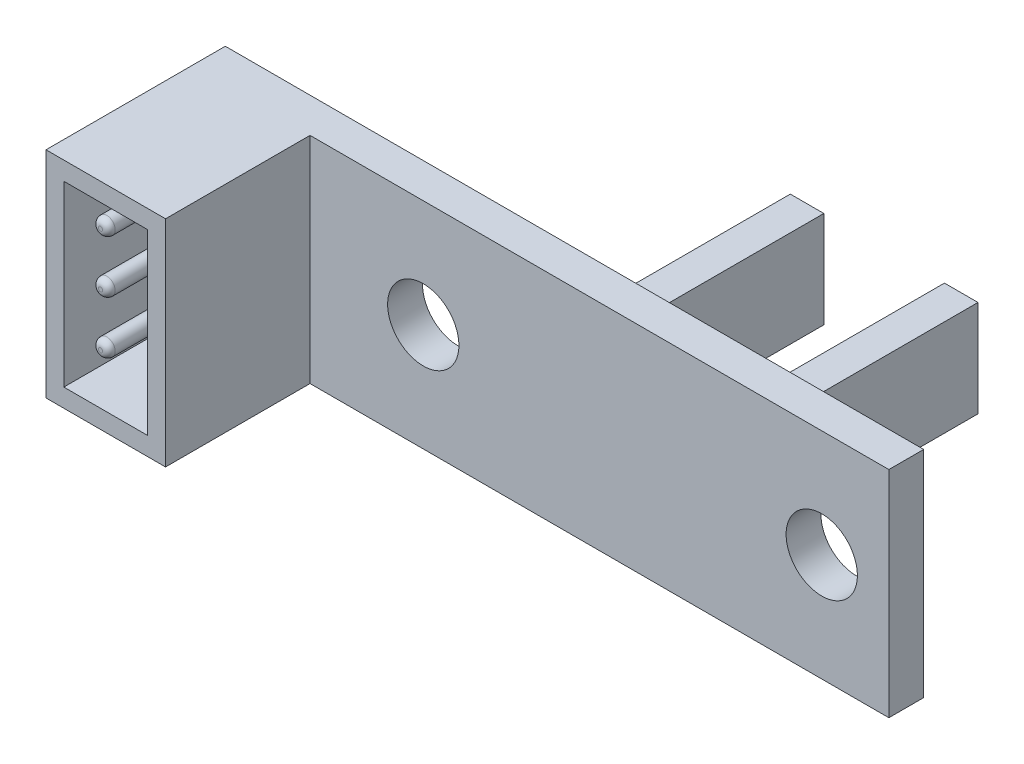
ISO-10303-21;
HEADER;
FILE_DESCRIPTION(('STEP AP214'),'2;1');
FILE_NAME('part.step','',(''),(''),'','','');
FILE_SCHEMA(('AUTOMOTIVE_DESIGN { 1 0 10303 214 1 1 1 1 }'));
ENDSEC;
DATA;
#1=APPLICATION_CONTEXT('core data for automotive mechanical design processes');
#2=APPLICATION_PROTOCOL_DEFINITION('international standard','automotive_design',2000,#1);
#3=PRODUCT_CONTEXT('',#1,'mechanical');
#4=PRODUCT('Part','Part','',(#3));
#5=PRODUCT_RELATED_PRODUCT_CATEGORY('part','',(#4));
#6=PRODUCT_DEFINITION_FORMATION('','',#4);
#7=PRODUCT_DEFINITION_CONTEXT('part definition',#1,'design');
#8=PRODUCT_DEFINITION('design','',#6,#7);
#9=PRODUCT_DEFINITION_SHAPE('','',#8);
#10=(LENGTH_UNIT() NAMED_UNIT(*) SI_UNIT(.MILLI.,.METRE.));
#11=(NAMED_UNIT(*) PLANE_ANGLE_UNIT() SI_UNIT($,.RADIAN.));
#12=(NAMED_UNIT(*) SI_UNIT($,.STERADIAN.) SOLID_ANGLE_UNIT());
#13=UNCERTAINTY_MEASURE_WITH_UNIT(LENGTH_MEASURE(1.E-05),#10,'distance_accuracy_value','');
#14=(GEOMETRIC_REPRESENTATION_CONTEXT(3) GLOBAL_UNCERTAINTY_ASSIGNED_CONTEXT((#13)) GLOBAL_UNIT_ASSIGNED_CONTEXT((#10,
#11,#12)) REPRESENTATION_CONTEXT('',''));
#15=CARTESIAN_POINT('',(0.,0.,0.));
#16=DIRECTION('',(0.,0.,1.));
#17=DIRECTION('',(1.,0.,0.));
#18=AXIS2_PLACEMENT_3D('',#15,#16,#17);
#19=CARTESIAN_POINT('',(0.,0.,0.));
#20=DIRECTION('',(0.,0.,-1.));
#21=DIRECTION('',(-1.,0.,0.));
#22=AXIS2_PLACEMENT_3D('',#19,#20,#21);
#23=PLANE('',#22);
#24=CARTESIAN_POINT('',(11.1,5.125,0.));
#25=DIRECTION('',(0.,0.,1.));
#26=DIRECTION('',(1.,0.,0.));
#27=AXIS2_PLACEMENT_3D('',#24,#25,#26);
#28=CIRCLE('',#27,1.7);
#29=CARTESIAN_POINT('',(12.8,5.125,0.));
#30=VERTEX_POINT('',#29);
#31=EDGE_CURVE('E226',#30,#30,#28,.T.);
#32=ORIENTED_EDGE('',*,*,#31,.T.);
#33=EDGE_LOOP('',(#32));
#34=FACE_BOUND('',#33,.T.);
#35=CARTESIAN_POINT('',(30.1,5.125,0.));
#36=DIRECTION('',(0.,0.,1.));
#37=DIRECTION('',(1.,0.,0.));
#38=AXIS2_PLACEMENT_3D('',#35,#36,#37);
#39=CIRCLE('',#38,1.69999999999999);
#40=CARTESIAN_POINT('',(31.8,5.125,0.));
#41=VERTEX_POINT('',#40);
#42=EDGE_CURVE('E233',#41,#41,#39,.T.);
#43=ORIENTED_EDGE('',*,*,#42,.T.);
#44=EDGE_LOOP('',(#43));
#45=FACE_BOUND('',#44,.T.);
#46=DIRECTION('',(0.,-1.,0.));
#47=VECTOR('',#46,1.);
#48=CARTESIAN_POINT('',(0.,0.,0.));
#49=LINE('',#48,#47);
#50=CARTESIAN_POINT('',(0.,10.25,0.));
#51=VERTEX_POINT('',#50);
#52=CARTESIAN_POINT('',(0.,0.,0.));
#53=VERTEX_POINT('',#52);
#54=EDGE_CURVE('E289',#51,#53,#49,.T.);
#55=ORIENTED_EDGE('',*,*,#54,.F.);
#56=DIRECTION('',(-1.,0.,0.));
#57=VECTOR('',#56,1.);
#58=CARTESIAN_POINT('',(0.,10.25,0.));
#59=LINE('',#58,#57);
#60=CARTESIAN_POINT('',(33.3,10.25,0.));
#61=VERTEX_POINT('',#60);
#62=EDGE_CURVE('E303',#61,#51,#59,.T.);
#63=ORIENTED_EDGE('',*,*,#62,.F.);
#64=DIRECTION('',(0.,1.,0.));
#65=VECTOR('',#64,1.);
#66=CARTESIAN_POINT('',(33.3,0.,0.));
#67=LINE('',#66,#65);
#68=CARTESIAN_POINT('',(33.3,0.,0.));
#69=VERTEX_POINT('',#68);
#70=EDGE_CURVE('E312',#69,#61,#67,.T.);
#71=ORIENTED_EDGE('',*,*,#70,.F.);
#72=DIRECTION('',(1.,0.,0.));
#73=VECTOR('',#72,1.);
#74=CARTESIAN_POINT('',(0.,0.,0.));
#75=LINE('',#74,#73);
#76=EDGE_CURVE('E310',#53,#69,#75,.T.);
#77=ORIENTED_EDGE('',*,*,#76,.F.);
#78=EDGE_LOOP('',(#55,#63,#71,#77));
#79=FACE_BOUND('',#78,.T.);
#80=DIRECTION('',(-1.,0.,0.));
#81=VECTOR('',#80,1.);
#82=CARTESIAN_POINT('',(25.7,2.825,0.));
#83=LINE('',#82,#81);
#84=CARTESIAN_POINT('',(25.7,2.825,0.));
#85=VERTEX_POINT('',#84);
#86=CARTESIAN_POINT('',(24.1,2.825,0.));
#87=VERTEX_POINT('',#86);
#88=EDGE_CURVE('E205',#85,#87,#83,.T.);
#89=ORIENTED_EDGE('',*,*,#88,.F.);
#90=DIRECTION('',(0.,-1.,0.));
#91=VECTOR('',#90,1.);
#92=CARTESIAN_POINT('',(25.7,7.425,0.));
#93=LINE('',#92,#91);
#94=CARTESIAN_POINT('',(25.7,7.425,0.));
#95=VERTEX_POINT('',#94);
#96=EDGE_CURVE('E184',#95,#85,#93,.T.);
#97=ORIENTED_EDGE('',*,*,#96,.F.);
#98=DIRECTION('',(1.,0.,0.));
#99=VECTOR('',#98,1.);
#100=CARTESIAN_POINT('',(25.7,7.425,0.));
#101=LINE('',#100,#99);
#102=CARTESIAN_POINT('',(24.1,7.425,0.));
#103=VERTEX_POINT('',#102);
#104=EDGE_CURVE('E198',#103,#95,#101,.T.);
#105=ORIENTED_EDGE('',*,*,#104,.F.);
#106=DIRECTION('',(0.,1.,0.));
#107=VECTOR('',#106,1.);
#108=CARTESIAN_POINT('',(24.1,7.425,0.));
#109=LINE('',#108,#107);
#110=EDGE_CURVE('E60',#87,#103,#109,.T.);
#111=ORIENTED_EDGE('',*,*,#110,.F.);
#112=EDGE_LOOP('',(#89,#97,#105,#111));
#113=FACE_BOUND('',#112,.T.);
#114=DIRECTION('',(-1.,0.,0.));
#115=VECTOR('',#114,1.);
#116=CARTESIAN_POINT('',(18.35,2.825,0.));
#117=LINE('',#116,#115);
#118=CARTESIAN_POINT('',(18.35,2.825,0.));
#119=VERTEX_POINT('',#118);
#120=CARTESIAN_POINT('',(16.75,2.825,0.));
#121=VERTEX_POINT('',#120);
#122=EDGE_CURVE('E194',#119,#121,#117,.T.);
#123=ORIENTED_EDGE('',*,*,#122,.F.);
#124=DIRECTION('',(0.,-1.,0.));
#125=VECTOR('',#124,1.);
#126=CARTESIAN_POINT('',(18.35,7.425,0.));
#127=LINE('',#126,#125);
#128=CARTESIAN_POINT('',(18.35,7.425,0.));
#129=VERTEX_POINT('',#128);
#130=EDGE_CURVE('E188',#129,#119,#127,.T.);
#131=ORIENTED_EDGE('',*,*,#130,.F.);
#132=DIRECTION('',(1.,0.,0.));
#133=VECTOR('',#132,1.);
#134=CARTESIAN_POINT('',(18.35,7.425,0.));
#135=LINE('',#134,#133);
#136=CARTESIAN_POINT('',(16.75,7.425,0.));
#137=VERTEX_POINT('',#136);
#138=EDGE_CURVE('E168',#137,#129,#135,.T.);
#139=ORIENTED_EDGE('',*,*,#138,.F.);
#140=DIRECTION('',(0.,1.,0.));
#141=VECTOR('',#140,1.);
#142=CARTESIAN_POINT('',(16.75,7.425,0.));
#143=LINE('',#142,#141);
#144=EDGE_CURVE('E52',#121,#137,#143,.T.);
#145=ORIENTED_EDGE('',*,*,#144,.F.);
#146=EDGE_LOOP('',(#123,#131,#139,#145));
#147=FACE_BOUND('',#146,.T.);
#148=ADVANCED_FACE('F37',(#34,#45,#79,#113,#147),#23,.T.);
#149=CARTESIAN_POINT('',(0.,0.,1.66));
#150=DIRECTION('',(0.,0.,-1.));
#151=DIRECTION('',(-1.,0.,0.));
#152=AXIS2_PLACEMENT_3D('',#149,#150,#151);
#153=PLANE('',#152);
#154=CARTESIAN_POINT('',(11.1,5.125,1.66));
#155=DIRECTION('',(0.,0.,1.));
#156=DIRECTION('',(1.,0.,0.));
#157=AXIS2_PLACEMENT_3D('',#154,#155,#156);
#158=CIRCLE('',#157,1.7);
#159=CARTESIAN_POINT('',(12.8,5.125,1.66));
#160=VERTEX_POINT('',#159);
#161=EDGE_CURVE('E230',#160,#160,#158,.T.);
#162=ORIENTED_EDGE('',*,*,#161,.F.);
#163=EDGE_LOOP('',(#162));
#164=FACE_BOUND('',#163,.T.);
#165=CARTESIAN_POINT('',(30.1,5.125,1.66));
#166=DIRECTION('',(0.,0.,1.));
#167=DIRECTION('',(1.,0.,0.));
#168=AXIS2_PLACEMENT_3D('',#165,#166,#167);
#169=CIRCLE('',#168,1.69999999999999);
#170=CARTESIAN_POINT('',(31.8,5.125,1.66));
#171=VERTEX_POINT('',#170);
#172=EDGE_CURVE('E214',#171,#171,#169,.T.);
#173=ORIENTED_EDGE('',*,*,#172,.F.);
#174=EDGE_LOOP('',(#173));
#175=FACE_BOUND('',#174,.T.);
#176=DIRECTION('',(0.,1.,0.));
#177=VECTOR('',#176,1.);
#178=CARTESIAN_POINT('',(5.7,10.25,1.66));
#179=LINE('',#178,#177);
#180=CARTESIAN_POINT('',(5.7,0.,1.66));
#181=VERTEX_POINT('',#180);
#182=CARTESIAN_POINT('',(5.7,10.25,1.66));
#183=VERTEX_POINT('',#182);
#184=EDGE_CURVE('E272',#181,#183,#179,.T.);
#185=ORIENTED_EDGE('',*,*,#184,.F.);
#186=DIRECTION('',(1.,0.,0.));
#187=VECTOR('',#186,1.);
#188=CARTESIAN_POINT('',(0.,0.,1.66));
#189=LINE('',#188,#187);
#190=CARTESIAN_POINT('',(33.3,0.,1.66));
#191=VERTEX_POINT('',#190);
#192=EDGE_CURVE('E300',#181,#191,#189,.T.);
#193=ORIENTED_EDGE('',*,*,#192,.T.);
#194=DIRECTION('',(0.,1.,0.));
#195=VECTOR('',#194,1.);
#196=CARTESIAN_POINT('',(33.3,0.,1.66));
#197=LINE('',#196,#195);
#198=CARTESIAN_POINT('',(33.3,10.25,1.66));
#199=VERTEX_POINT('',#198);
#200=EDGE_CURVE('E302',#191,#199,#197,.T.);
#201=ORIENTED_EDGE('',*,*,#200,.T.);
#202=DIRECTION('',(-1.,0.,0.));
#203=VECTOR('',#202,1.);
#204=CARTESIAN_POINT('',(0.,10.25,1.66));
#205=LINE('',#204,#203);
#206=EDGE_CURVE('E305',#199,#183,#205,.T.);
#207=ORIENTED_EDGE('',*,*,#206,.T.);
#208=EDGE_LOOP('',(#185,#193,#201,#207));
#209=FACE_BOUND('',#208,.T.);
#210=ADVANCED_FACE('F357',(#164,#175,#209),#153,.F.);
#211=CARTESIAN_POINT('',(0.,0.,1.66));
#212=DIRECTION('',(1.,0.,0.));
#213=DIRECTION('',(0.,0.,-1.));
#214=AXIS2_PLACEMENT_3D('',#211,#212,#213);
#215=PLANE('',#214);
#216=ORIENTED_EDGE('',*,*,#54,.T.);
#217=DIRECTION('',(0.,0.,-1.));
#218=VECTOR('',#217,1.);
#219=CARTESIAN_POINT('',(0.,0.,1.66));
#220=LINE('',#219,#218);
#221=CARTESIAN_POINT('',(0.,0.,8.55));
#222=VERTEX_POINT('',#221);
#223=EDGE_CURVE('E323',#222,#53,#220,.T.);
#224=ORIENTED_EDGE('',*,*,#223,.F.);
#225=DIRECTION('',(0.,1.,0.));
#226=VECTOR('',#225,1.);
#227=CARTESIAN_POINT('',(0.,10.25,8.55));
#228=LINE('',#227,#226);
#229=CARTESIAN_POINT('',(0.,10.25,8.55));
#230=VERTEX_POINT('',#229);
#231=EDGE_CURVE('E286',#222,#230,#228,.T.);
#232=ORIENTED_EDGE('',*,*,#231,.T.);
#233=DIRECTION('',(0.,0.,-1.));
#234=VECTOR('',#233,1.);
#235=CARTESIAN_POINT('',(0.,10.25,1.66));
#236=LINE('',#235,#234);
#237=EDGE_CURVE('E307',#230,#51,#236,.T.);
#238=ORIENTED_EDGE('',*,*,#237,.T.);
#239=EDGE_LOOP('',(#216,#224,#232,#238));
#240=FACE_BOUND('',#239,.T.);
#241=ADVANCED_FACE('F365',(#240),#215,.F.);
#242=CARTESIAN_POINT('',(0.,0.,1.66));
#243=DIRECTION('',(0.,1.,0.));
#244=DIRECTION('',(0.,0.,1.));
#245=AXIS2_PLACEMENT_3D('',#242,#243,#244);
#246=PLANE('',#245);
#247=ORIENTED_EDGE('',*,*,#76,.T.);
#248=DIRECTION('',(0.,0.,-1.));
#249=VECTOR('',#248,1.);
#250=CARTESIAN_POINT('',(33.3,0.,1.66));
#251=LINE('',#250,#249);
#252=EDGE_CURVE('E320',#191,#69,#251,.T.);
#253=ORIENTED_EDGE('',*,*,#252,.F.);
#254=ORIENTED_EDGE('',*,*,#192,.F.);
#255=DIRECTION('',(0.,0.,-1.));
#256=VECTOR('',#255,1.);
#257=CARTESIAN_POINT('',(5.7,0.,28.8282777934358));
#258=LINE('',#257,#256);
#259=CARTESIAN_POINT('',(5.7,0.,8.55));
#260=VERTEX_POINT('',#259);
#261=EDGE_CURVE('E295',#260,#181,#258,.T.);
#262=ORIENTED_EDGE('',*,*,#261,.F.);
#263=DIRECTION('',(-1.,0.,0.));
#264=VECTOR('',#263,1.);
#265=CARTESIAN_POINT('',(0.,0.,8.55));
#266=LINE('',#265,#264);
#267=EDGE_CURVE('E282',#260,#222,#266,.T.);
#268=ORIENTED_EDGE('',*,*,#267,.T.);
#269=ORIENTED_EDGE('',*,*,#223,.T.);
#270=EDGE_LOOP('',(#247,#253,#254,#262,#268,#269));
#271=FACE_BOUND('',#270,.T.);
#272=ADVANCED_FACE('F379',(#271),#246,.F.);
#273=CARTESIAN_POINT('',(33.3,0.,1.66));
#274=DIRECTION('',(-1.,0.,0.));
#275=DIRECTION('',(0.,0.,1.));
#276=AXIS2_PLACEMENT_3D('',#273,#274,#275);
#277=PLANE('',#276);
#278=ORIENTED_EDGE('',*,*,#70,.T.);
#279=DIRECTION('',(0.,0.,-1.));
#280=VECTOR('',#279,1.);
#281=CARTESIAN_POINT('',(33.3,10.25,1.66));
#282=LINE('',#281,#280);
#283=EDGE_CURVE('E317',#199,#61,#282,.T.);
#284=ORIENTED_EDGE('',*,*,#283,.F.);
#285=ORIENTED_EDGE('',*,*,#200,.F.);
#286=ORIENTED_EDGE('',*,*,#252,.T.);
#287=EDGE_LOOP('',(#278,#284,#285,#286));
#288=FACE_BOUND('',#287,.T.);
#289=ADVANCED_FACE('F375',(#288),#277,.F.);
#290=CARTESIAN_POINT('',(0.,10.25,1.66));
#291=DIRECTION('',(0.,-1.,0.));
#292=DIRECTION('',(0.,0.,-1.));
#293=AXIS2_PLACEMENT_3D('',#290,#291,#292);
#294=PLANE('',#293);
#295=ORIENTED_EDGE('',*,*,#62,.T.);
#296=ORIENTED_EDGE('',*,*,#237,.F.);
#297=DIRECTION('',(1.,0.,0.));
#298=VECTOR('',#297,1.);
#299=CARTESIAN_POINT('',(0.,10.25,8.55));
#300=LINE('',#299,#298);
#301=CARTESIAN_POINT('',(5.7,10.25,8.55));
#302=VERTEX_POINT('',#301);
#303=EDGE_CURVE('E283',#230,#302,#300,.T.);
#304=ORIENTED_EDGE('',*,*,#303,.T.);
#305=DIRECTION('',(0.,0.,-1.));
#306=VECTOR('',#305,1.);
#307=CARTESIAN_POINT('',(5.7,10.25,28.8282777934358));
#308=LINE('',#307,#306);
#309=EDGE_CURVE('E292',#302,#183,#308,.T.);
#310=ORIENTED_EDGE('',*,*,#309,.T.);
#311=ORIENTED_EDGE('',*,*,#206,.F.);
#312=ORIENTED_EDGE('',*,*,#283,.T.);
#313=EDGE_LOOP('',(#295,#296,#304,#310,#311,#312));
#314=FACE_BOUND('',#313,.T.);
#315=ADVANCED_FACE('F371',(#314),#294,.F.);
#316=CARTESIAN_POINT('',(5.7,10.25,28.8282777934358));
#317=DIRECTION('',(-1.,0.,0.));
#318=DIRECTION('',(0.,-1.,0.));
#319=AXIS2_PLACEMENT_3D('',#316,#317,#318);
#320=PLANE('',#319);
#321=ORIENTED_EDGE('',*,*,#309,.F.);
#322=DIRECTION('',(0.,-1.,0.));
#323=VECTOR('',#322,1.);
#324=CARTESIAN_POINT('',(5.7,10.25,8.55));
#325=LINE('',#324,#323);
#326=EDGE_CURVE('E279',#302,#260,#325,.T.);
#327=ORIENTED_EDGE('',*,*,#326,.T.);
#328=ORIENTED_EDGE('',*,*,#261,.T.);
#329=ORIENTED_EDGE('',*,*,#184,.T.);
#330=EDGE_LOOP('',(#321,#327,#328,#329));
#331=FACE_BOUND('',#330,.T.);
#332=ADVANCED_FACE('F374',(#331),#320,.F.);
#333=CARTESIAN_POINT('',(0.,0.,8.55));
#334=DIRECTION('',(0.,0.,-1.));
#335=DIRECTION('',(-1.,0.,0.));
#336=AXIS2_PLACEMENT_3D('',#333,#334,#335);
#337=PLANE('',#336);
#338=DIRECTION('',(1.,0.,0.));
#339=VECTOR('',#338,1.);
#340=CARTESIAN_POINT('',(0.850000000000001,0.875,8.55));
#341=LINE('',#340,#339);
#342=CARTESIAN_POINT('',(0.850000000000001,0.875,8.55));
#343=VERTEX_POINT('',#342);
#344=CARTESIAN_POINT('',(4.85,0.875,8.55));
#345=VERTEX_POINT('',#344);
#346=EDGE_CURVE('E262',#343,#345,#341,.T.);
#347=ORIENTED_EDGE('',*,*,#346,.F.);
#348=DIRECTION('',(0.,-1.,0.));
#349=VECTOR('',#348,1.);
#350=CARTESIAN_POINT('',(0.850000000000001,9.375,8.55));
#351=LINE('',#350,#349);
#352=CARTESIAN_POINT('',(0.850000000000001,9.375,8.55));
#353=VERTEX_POINT('',#352);
#354=EDGE_CURVE('E246',#353,#343,#351,.T.);
#355=ORIENTED_EDGE('',*,*,#354,.F.);
#356=DIRECTION('',(-1.,0.,0.));
#357=VECTOR('',#356,1.);
#358=CARTESIAN_POINT('',(0.850000000000001,9.375,8.55));
#359=LINE('',#358,#357);
#360=CARTESIAN_POINT('',(4.85,9.375,8.55));
#361=VERTEX_POINT('',#360);
#362=EDGE_CURVE('E251',#361,#353,#359,.T.);
#363=ORIENTED_EDGE('',*,*,#362,.F.);
#364=DIRECTION('',(0.,1.,0.));
#365=VECTOR('',#364,1.);
#366=CARTESIAN_POINT('',(4.85,9.375,8.55));
#367=LINE('',#366,#365);
#368=EDGE_CURVE('E265',#345,#361,#367,.T.);
#369=ORIENTED_EDGE('',*,*,#368,.F.);
#370=EDGE_LOOP('',(#347,#355,#363,#369));
#371=FACE_BOUND('',#370,.T.);
#372=ORIENTED_EDGE('',*,*,#267,.F.);
#373=ORIENTED_EDGE('',*,*,#326,.F.);
#374=ORIENTED_EDGE('',*,*,#303,.F.);
#375=ORIENTED_EDGE('',*,*,#231,.F.);
#376=EDGE_LOOP('',(#372,#373,#374,#375));
#377=FACE_BOUND('',#376,.T.);
#378=ADVANCED_FACE('F431',(#371,#377),#337,.F.);
#379=CARTESIAN_POINT('',(0.850000000000001,9.375,2.5));
#380=DIRECTION('',(-1.,0.,0.));
#381=DIRECTION('',(0.,-1.,0.));
#382=AXIS2_PLACEMENT_3D('',#379,#380,#381);
#383=PLANE('',#382);
#384=ORIENTED_EDGE('',*,*,#354,.T.);
#385=DIRECTION('',(0.,0.,1.));
#386=VECTOR('',#385,1.);
#387=CARTESIAN_POINT('',(0.850000000000001,0.875,2.5));
#388=LINE('',#387,#386);
#389=CARTESIAN_POINT('',(0.850000000000001,0.875,2.5));
#390=VERTEX_POINT('',#389);
#391=EDGE_CURVE('E260',#390,#343,#388,.T.);
#392=ORIENTED_EDGE('',*,*,#391,.F.);
#393=DIRECTION('',(0.,-1.,0.));
#394=VECTOR('',#393,1.);
#395=CARTESIAN_POINT('',(0.850000000000001,9.375,2.5));
#396=LINE('',#395,#394);
#397=CARTESIAN_POINT('',(0.850000000000001,9.375,2.5));
#398=VERTEX_POINT('',#397);
#399=EDGE_CURVE('E247',#398,#390,#396,.T.);
#400=ORIENTED_EDGE('',*,*,#399,.F.);
#401=DIRECTION('',(0.,0.,1.));
#402=VECTOR('',#401,1.);
#403=CARTESIAN_POINT('',(0.850000000000001,9.375,2.5));
#404=LINE('',#403,#402);
#405=EDGE_CURVE('E270',#398,#353,#404,.T.);
#406=ORIENTED_EDGE('',*,*,#405,.T.);
#407=EDGE_LOOP('',(#384,#392,#400,#406));
#408=FACE_BOUND('',#407,.T.);
#409=ADVANCED_FACE('F419',(#408),#383,.F.);
#410=CARTESIAN_POINT('',(0.850000000000001,9.375,2.5));
#411=DIRECTION('',(0.,1.,0.));
#412=DIRECTION('',(0.,0.,1.));
#413=AXIS2_PLACEMENT_3D('',#410,#411,#412);
#414=PLANE('',#413);
#415=ORIENTED_EDGE('',*,*,#362,.T.);
#416=ORIENTED_EDGE('',*,*,#405,.F.);
#417=DIRECTION('',(-1.,0.,0.));
#418=VECTOR('',#417,1.);
#419=CARTESIAN_POINT('',(0.850000000000001,9.375,2.5));
#420=LINE('',#419,#418);
#421=CARTESIAN_POINT('',(4.85,9.375,2.5));
#422=VERTEX_POINT('',#421);
#423=EDGE_CURVE('E257',#422,#398,#420,.T.);
#424=ORIENTED_EDGE('',*,*,#423,.F.);
#425=DIRECTION('',(0.,0.,1.));
#426=VECTOR('',#425,1.);
#427=CARTESIAN_POINT('',(4.85,9.375,2.5));
#428=LINE('',#427,#426);
#429=EDGE_CURVE('E273',#422,#361,#428,.T.);
#430=ORIENTED_EDGE('',*,*,#429,.T.);
#431=EDGE_LOOP('',(#415,#416,#424,#430));
#432=FACE_BOUND('',#431,.T.);
#433=ADVANCED_FACE('F428',(#432),#414,.F.);
#434=CARTESIAN_POINT('',(4.85,9.375,2.5));
#435=DIRECTION('',(1.,0.,0.));
#436=DIRECTION('',(0.,0.,-1.));
#437=AXIS2_PLACEMENT_3D('',#434,#435,#436);
#438=PLANE('',#437);
#439=ORIENTED_EDGE('',*,*,#368,.T.);
#440=ORIENTED_EDGE('',*,*,#429,.F.);
#441=DIRECTION('',(0.,1.,0.));
#442=VECTOR('',#441,1.);
#443=CARTESIAN_POINT('',(4.85,9.375,2.5));
#444=LINE('',#443,#442);
#445=CARTESIAN_POINT('',(4.85,0.875,2.5));
#446=VERTEX_POINT('',#445);
#447=EDGE_CURVE('E254',#446,#422,#444,.T.);
#448=ORIENTED_EDGE('',*,*,#447,.F.);
#449=DIRECTION('',(0.,0.,1.));
#450=VECTOR('',#449,1.);
#451=CARTESIAN_POINT('',(4.85,0.875,2.5));
#452=LINE('',#451,#450);
#453=EDGE_CURVE('E275',#446,#345,#452,.T.);
#454=ORIENTED_EDGE('',*,*,#453,.T.);
#455=EDGE_LOOP('',(#439,#440,#448,#454));
#456=FACE_BOUND('',#455,.T.);
#457=ADVANCED_FACE('F426',(#456),#438,.F.);
#458=CARTESIAN_POINT('',(0.850000000000001,0.875,2.5));
#459=DIRECTION('',(0.,-1.,0.));
#460=DIRECTION('',(0.,0.,-1.));
#461=AXIS2_PLACEMENT_3D('',#458,#459,#460);
#462=PLANE('',#461);
#463=ORIENTED_EDGE('',*,*,#346,.T.);
#464=ORIENTED_EDGE('',*,*,#453,.F.);
#465=DIRECTION('',(1.,0.,0.));
#466=VECTOR('',#465,1.);
#467=CARTESIAN_POINT('',(0.850000000000001,0.875,2.5));
#468=LINE('',#467,#466);
#469=EDGE_CURVE('E250',#390,#446,#468,.T.);
#470=ORIENTED_EDGE('',*,*,#469,.F.);
#471=ORIENTED_EDGE('',*,*,#391,.T.);
#472=EDGE_LOOP('',(#463,#464,#470,#471));
#473=FACE_BOUND('',#472,.T.);
#474=ADVANCED_FACE('F409',(#473),#462,.F.);
#475=CARTESIAN_POINT('',(0.,0.,2.5));
#476=DIRECTION('',(0.,0.,1.));
#477=DIRECTION('',(1.,0.,0.));
#478=AXIS2_PLACEMENT_3D('',#475,#476,#477);
#479=PLANE('',#478);
#480=CARTESIAN_POINT('',(2.0507601910939,2.7210386372354,2.5));
#481=DIRECTION('',(0.,0.,1.));
#482=DIRECTION('',(1.,0.,0.));
#483=AXIS2_PLACEMENT_3D('',#480,#481,#482);
#484=CIRCLE('',#483,0.4);
#485=CARTESIAN_POINT('',(2.4507601910939,2.7210386372354,2.5));
#486=VERTEX_POINT('',#485);
#487=EDGE_CURVE('E229',#486,#486,#484,.T.);
#488=ORIENTED_EDGE('',*,*,#487,.F.);
#489=EDGE_LOOP('',(#488));
#490=FACE_BOUND('',#489,.T.);
#491=CARTESIAN_POINT('',(2.0507601910939,7.7410386372354,2.5));
#492=DIRECTION('',(0.,0.,1.));
#493=DIRECTION('',(1.,0.,0.));
#494=AXIS2_PLACEMENT_3D('',#491,#492,#493);
#495=CIRCLE('',#494,0.4);
#496=CARTESIAN_POINT('',(2.4507601910939,7.7410386372354,2.5));
#497=VERTEX_POINT('',#496);
#498=EDGE_CURVE('E240',#497,#497,#495,.T.);
#499=ORIENTED_EDGE('',*,*,#498,.F.);
#500=EDGE_LOOP('',(#499));
#501=FACE_BOUND('',#500,.T.);
#502=CARTESIAN_POINT('',(2.0507601910939,5.2310386372354,2.5));
#503=DIRECTION('',(0.,0.,1.));
#504=DIRECTION('',(1.,0.,0.));
#505=AXIS2_PLACEMENT_3D('',#502,#503,#504);
#506=CIRCLE('',#505,0.4);
#507=CARTESIAN_POINT('',(2.4507601910939,5.2310386372354,2.5));
#508=VERTEX_POINT('',#507);
#509=EDGE_CURVE('E243',#508,#508,#506,.T.);
#510=ORIENTED_EDGE('',*,*,#509,.F.);
#511=EDGE_LOOP('',(#510));
#512=FACE_BOUND('',#511,.T.);
#513=ORIENTED_EDGE('',*,*,#399,.T.);
#514=ORIENTED_EDGE('',*,*,#469,.T.);
#515=ORIENTED_EDGE('',*,*,#447,.T.);
#516=ORIENTED_EDGE('',*,*,#423,.T.);
#517=EDGE_LOOP('',(#513,#514,#515,#516));
#518=FACE_BOUND('',#517,.T.);
#519=ADVANCED_FACE('F405',(#490,#501,#512,#518),#479,.T.);
#520=CARTESIAN_POINT('',(2.0507601910939,5.2310386372354,8.));
#521=DIRECTION('',(0.,0.,-1.));
#522=DIRECTION('',(-1.,0.,0.));
#523=AXIS2_PLACEMENT_3D('',#520,#521,#522);
#524=CYLINDRICAL_SURFACE('',#523,0.4);
#525=CARTESIAN_POINT('',(2.0507601910939,5.2310386372354,7.7));
#526=DIRECTION('',(0.,0.,1.));
#527=DIRECTION('',(1.,0.,0.));
#528=AXIS2_PLACEMENT_3D('',#525,#526,#527);
#529=CIRCLE('',#528,0.4);
#530=CARTESIAN_POINT('',(2.4507601910939,5.2310386372354,7.7));
#531=VERTEX_POINT('',#530);
#532=EDGE_CURVE('E335',#531,#531,#529,.F.);
#533=ORIENTED_EDGE('',*,*,#532,.T.);
#534=EDGE_LOOP('',(#533));
#535=FACE_BOUND('',#534,.T.);
#536=ORIENTED_EDGE('',*,*,#509,.T.);
#537=EDGE_LOOP('',(#536));
#538=FACE_BOUND('',#537,.T.);
#539=ADVANCED_FACE('F408',(#535,#538),#524,.T.);
#540=CARTESIAN_POINT('',(2.0507601910939,5.2310386372354,8.));
#541=DIRECTION('',(0.,0.,1.));
#542=DIRECTION('',(1.,0.,0.));
#543=AXIS2_PLACEMENT_3D('',#540,#541,#542);
#544=PLANE('',#543);
#545=CARTESIAN_POINT('',(2.0507601910939,5.2310386372354,8.));
#546=DIRECTION('',(0.,0.,1.));
#547=DIRECTION('',(1.,0.,0.));
#548=AXIS2_PLACEMENT_3D('',#545,#546,#547);
#549=CIRCLE('',#548,0.1);
#550=CARTESIAN_POINT('',(2.1507601910939,5.2310386372354,8.));
#551=VERTEX_POINT('',#550);
#552=EDGE_CURVE('E332',#551,#551,#549,.T.);
#553=ORIENTED_EDGE('',*,*,#552,.T.);
#554=EDGE_LOOP('',(#553));
#555=FACE_BOUND('',#554,.T.);
#556=ADVANCED_FACE('F502',(#555),#544,.T.);
#557=CARTESIAN_POINT('',(2.0507601910939,7.7410386372354,8.));
#558=DIRECTION('',(0.,0.,-1.));
#559=DIRECTION('',(-1.,0.,0.));
#560=AXIS2_PLACEMENT_3D('',#557,#558,#559);
#561=CYLINDRICAL_SURFACE('',#560,0.4);
#562=CARTESIAN_POINT('',(2.0507601910939,7.7410386372354,7.7));
#563=DIRECTION('',(0.,0.,1.));
#564=DIRECTION('',(1.,0.,0.));
#565=AXIS2_PLACEMENT_3D('',#562,#563,#564);
#566=CIRCLE('',#565,0.4);
#567=CARTESIAN_POINT('',(2.4507601910939,7.7410386372354,7.7));
#568=VERTEX_POINT('',#567);
#569=EDGE_CURVE('E12',#568,#568,#566,.F.);
#570=ORIENTED_EDGE('',*,*,#569,.T.);
#571=EDGE_LOOP('',(#570));
#572=FACE_BOUND('',#571,.T.);
#573=ORIENTED_EDGE('',*,*,#498,.T.);
#574=EDGE_LOOP('',(#573));
#575=FACE_BOUND('',#574,.T.);
#576=ADVANCED_FACE('F499',(#572,#575),#561,.T.);
#577=CARTESIAN_POINT('',(2.0507601910939,7.7410386372354,8.));
#578=DIRECTION('',(0.,0.,1.));
#579=DIRECTION('',(1.,0.,0.));
#580=AXIS2_PLACEMENT_3D('',#577,#578,#579);
#581=PLANE('',#580);
#582=CARTESIAN_POINT('',(2.0507601910939,7.7410386372354,8.));
#583=DIRECTION('',(0.,0.,1.));
#584=DIRECTION('',(1.,0.,0.));
#585=AXIS2_PLACEMENT_3D('',#582,#583,#584);
#586=CIRCLE('',#585,0.1);
#587=CARTESIAN_POINT('',(2.1507601910939,7.7410386372354,8.));
#588=VERTEX_POINT('',#587);
#589=EDGE_CURVE('E45',#588,#588,#586,.T.);
#590=ORIENTED_EDGE('',*,*,#589,.T.);
#591=EDGE_LOOP('',(#590));
#592=FACE_BOUND('',#591,.T.);
#593=ADVANCED_FACE('F340',(#592),#581,.T.);
#594=CARTESIAN_POINT('',(2.0507601910939,2.7210386372354,8.));
#595=DIRECTION('',(0.,0.,-1.));
#596=DIRECTION('',(-1.,0.,0.));
#597=AXIS2_PLACEMENT_3D('',#594,#595,#596);
#598=CYLINDRICAL_SURFACE('',#597,0.4);
#599=CARTESIAN_POINT('',(2.0507601910939,2.7210386372354,7.7));
#600=DIRECTION('',(0.,0.,1.));
#601=DIRECTION('',(1.,0.,0.));
#602=AXIS2_PLACEMENT_3D('',#599,#600,#601);
#603=CIRCLE('',#602,0.4);
#604=CARTESIAN_POINT('',(2.4507601910939,2.7210386372354,7.7));
#605=VERTEX_POINT('',#604);
#606=EDGE_CURVE('E329',#605,#605,#603,.F.);
#607=ORIENTED_EDGE('',*,*,#606,.T.);
#608=EDGE_LOOP('',(#607));
#609=FACE_BOUND('',#608,.T.);
#610=ORIENTED_EDGE('',*,*,#487,.T.);
#611=EDGE_LOOP('',(#610));
#612=FACE_BOUND('',#611,.T.);
#613=ADVANCED_FACE('F393',(#609,#612),#598,.T.);
#614=CARTESIAN_POINT('',(2.0507601910939,2.7210386372354,8.));
#615=DIRECTION('',(0.,0.,1.));
#616=DIRECTION('',(1.,0.,0.));
#617=AXIS2_PLACEMENT_3D('',#614,#615,#616);
#618=PLANE('',#617);
#619=CARTESIAN_POINT('',(2.0507601910939,2.7210386372354,8.));
#620=DIRECTION('',(0.,0.,1.));
#621=DIRECTION('',(1.,0.,0.));
#622=AXIS2_PLACEMENT_3D('',#619,#620,#621);
#623=CIRCLE('',#622,0.1);
#624=CARTESIAN_POINT('',(2.1507601910939,2.7210386372354,8.));
#625=VERTEX_POINT('',#624);
#626=EDGE_CURVE('E326',#625,#625,#623,.T.);
#627=ORIENTED_EDGE('',*,*,#626,.T.);
#628=EDGE_LOOP('',(#627));
#629=FACE_BOUND('',#628,.T.);
#630=ADVANCED_FACE('F388',(#629),#618,.T.);
#631=CARTESIAN_POINT('',(2.0507601910939,2.7210386372354,7.7));
#632=DIRECTION('',(0.,0.,1.));
#633=DIRECTION('',(1.,0.,0.));
#634=AXIS2_PLACEMENT_3D('',#631,#632,#633);
#635=DEGENERATE_TOROIDAL_SURFACE('',#634,0.1,0.3,.T.);
#636=ORIENTED_EDGE('',*,*,#606,.F.);
#637=EDGE_LOOP('',(#636));
#638=FACE_BOUND('',#637,.T.);
#639=ORIENTED_EDGE('',*,*,#626,.F.);
#640=EDGE_LOOP('',(#639));
#641=FACE_BOUND('',#640,.T.);
#642=ADVANCED_FACE('F353',(#638,#641),#635,.T.);
#643=CARTESIAN_POINT('',(2.0507601910939,5.2310386372354,7.7));
#644=DIRECTION('',(0.,0.,1.));
#645=DIRECTION('',(1.,0.,0.));
#646=AXIS2_PLACEMENT_3D('',#643,#644,#645);
#647=DEGENERATE_TOROIDAL_SURFACE('',#646,0.1,0.3,.T.);
#648=ORIENTED_EDGE('',*,*,#532,.F.);
#649=EDGE_LOOP('',(#648));
#650=FACE_BOUND('',#649,.T.);
#651=ORIENTED_EDGE('',*,*,#552,.F.);
#652=EDGE_LOOP('',(#651));
#653=FACE_BOUND('',#652,.T.);
#654=ADVANCED_FACE('F344',(#650,#653),#647,.T.);
#655=CARTESIAN_POINT('',(2.0507601910939,7.7410386372354,7.7));
#656=DIRECTION('',(0.,0.,1.));
#657=DIRECTION('',(1.,0.,0.));
#658=AXIS2_PLACEMENT_3D('',#655,#656,#657);
#659=DEGENERATE_TOROIDAL_SURFACE('',#658,0.1,0.3,.T.);
#660=ORIENTED_EDGE('',*,*,#569,.F.);
#661=EDGE_LOOP('',(#660));
#662=FACE_BOUND('',#661,.T.);
#663=ORIENTED_EDGE('',*,*,#589,.F.);
#664=EDGE_LOOP('',(#663));
#665=FACE_BOUND('',#664,.T.);
#666=ADVANCED_FACE('F39',(#662,#665),#659,.T.);
#667=CARTESIAN_POINT('',(30.1,5.125,0.));
#668=DIRECTION('',(0.,0.,1.));
#669=DIRECTION('',(1.,0.,0.));
#670=AXIS2_PLACEMENT_3D('',#667,#668,#669);
#671=CYLINDRICAL_SURFACE('',#670,1.69999999999999);
#672=CARTESIAN_POINT('',(31.8,5.125,0.));
#673=CARTESIAN_POINT('',(31.8,5.125,0.0172916666666666));
#674=CARTESIAN_POINT('',(31.8,5.125,0.0345833333333333));
#675=CARTESIAN_POINT('',(31.8,5.125,0.0691666666666667));
#676=CARTESIAN_POINT('',(31.8,5.125,0.0864583333333333));
#677=CARTESIAN_POINT('',(31.8,5.125,0.121041666666667));
#678=CARTESIAN_POINT('',(31.8,5.125,0.138333333333333));
#679=CARTESIAN_POINT('',(31.8,5.125,0.172916666666667));
#680=CARTESIAN_POINT('',(31.8,5.125,0.190208333333333));
#681=CARTESIAN_POINT('',(31.8,5.125,0.224791666666667));
#682=CARTESIAN_POINT('',(31.8,5.125,0.242083333333333));
#683=CARTESIAN_POINT('',(31.8,5.125,0.276666666666667));
#684=CARTESIAN_POINT('',(31.8,5.125,0.293958333333333));
#685=CARTESIAN_POINT('',(31.8,5.125,0.328541666666667));
#686=CARTESIAN_POINT('',(31.8,5.125,0.345833333333333));
#687=CARTESIAN_POINT('',(31.8,5.125,0.380416666666667));
#688=CARTESIAN_POINT('',(31.8,5.125,0.397708333333333));
#689=CARTESIAN_POINT('',(31.8,5.125,0.432291666666667));
#690=CARTESIAN_POINT('',(31.8,5.125,0.449583333333333));
#691=CARTESIAN_POINT('',(31.8,5.125,0.484166666666667));
#692=CARTESIAN_POINT('',(31.8,5.125,0.501458333333333));
#693=CARTESIAN_POINT('',(31.8,5.125,0.536041666666667));
#694=CARTESIAN_POINT('',(31.8,5.125,0.553333333333333));
#695=CARTESIAN_POINT('',(31.8,5.125,0.587916666666667));
#696=CARTESIAN_POINT('',(31.8,5.125,0.605208333333333));
#697=CARTESIAN_POINT('',(31.8,5.125,0.639791666666667));
#698=CARTESIAN_POINT('',(31.8,5.125,0.657083333333333));
#699=CARTESIAN_POINT('',(31.8,5.125,0.691666666666667));
#700=CARTESIAN_POINT('',(31.8,5.125,0.708958333333333));
#701=CARTESIAN_POINT('',(31.8,5.125,0.743541666666667));
#702=CARTESIAN_POINT('',(31.8,5.125,0.760833333333333));
#703=CARTESIAN_POINT('',(31.8,5.125,0.795416666666666));
#704=CARTESIAN_POINT('',(31.8,5.125,0.812708333333333));
#705=CARTESIAN_POINT('',(31.8,5.125,0.847291666666667));
#706=CARTESIAN_POINT('',(31.8,5.125,0.864583333333333));
#707=CARTESIAN_POINT('',(31.8,5.125,0.899166666666667));
#708=CARTESIAN_POINT('',(31.8,5.125,0.916458333333333));
#709=CARTESIAN_POINT('',(31.8,5.125,0.951041666666667));
#710=CARTESIAN_POINT('',(31.8,5.125,0.968333333333333));
#711=CARTESIAN_POINT('',(31.8,5.125,1.00291666666667));
#712=CARTESIAN_POINT('',(31.8,5.125,1.02020833333333));
#713=CARTESIAN_POINT('',(31.8,5.125,1.05479166666667));
#714=CARTESIAN_POINT('',(31.8,5.125,1.07208333333333));
#715=CARTESIAN_POINT('',(31.8,5.125,1.10666666666667));
#716=CARTESIAN_POINT('',(31.8,5.125,1.12395833333333));
#717=CARTESIAN_POINT('',(31.8,5.125,1.15854166666667));
#718=CARTESIAN_POINT('',(31.8,5.125,1.17583333333333));
#719=CARTESIAN_POINT('',(31.8,5.125,1.21041666666667));
#720=CARTESIAN_POINT('',(31.8,5.125,1.22770833333333));
#721=CARTESIAN_POINT('',(31.8,5.125,1.26229166666667));
#722=CARTESIAN_POINT('',(31.8,5.125,1.27958333333333));
#723=CARTESIAN_POINT('',(31.8,5.125,1.31416666666667));
#724=CARTESIAN_POINT('',(31.8,5.125,1.33145833333333));
#725=CARTESIAN_POINT('',(31.8,5.125,1.36604166666667));
#726=CARTESIAN_POINT('',(31.8,5.125,1.38333333333333));
#727=CARTESIAN_POINT('',(31.8,5.125,1.41791666666667));
#728=CARTESIAN_POINT('',(31.8,5.125,1.43520833333333));
#729=CARTESIAN_POINT('',(31.8,5.125,1.46979166666667));
#730=CARTESIAN_POINT('',(31.8,5.125,1.48708333333333));
#731=CARTESIAN_POINT('',(31.8,5.125,1.52166666666667));
#732=CARTESIAN_POINT('',(31.8,5.125,1.53895833333333));
#733=CARTESIAN_POINT('',(31.8,5.125,1.57354166666667));
#734=CARTESIAN_POINT('',(31.8,5.125,1.59083333333333));
#735=CARTESIAN_POINT('',(31.8,5.125,1.62541666666667));
#736=CARTESIAN_POINT('',(31.8,5.125,1.64270833333333));
#737=CARTESIAN_POINT('',(31.8,5.125,1.66));
#738=B_SPLINE_CURVE_WITH_KNOTS('',3,(#672,#673,#674,#675,#676,#677,#678,#679,#680,#681,#682,
#683,#684,#685,#686,#687,#688,#689,#690,#691,#692,#693,#694,#695,#696,#697,#698,#699,#700,#701,
#702,#703,#704,#705,#706,#707,#708,#709,#710,#711,#712,#713,#714,#715,#716,#717,#718,#719,#720,
#721,#722,#723,#724,#725,#726,#727,#728,#729,#730,#731,#732,#733,#734,#735,#736,#737),
.UNSPECIFIED.,.F.,.F.,(4,2,2,2,2,2,2,2,2,2,2,2,2,2,2,2,2,2,2,2,2,2,2,2,2,2,2,2,2,2,2,2,4),(0.,
0.051875,0.10375,0.155625,0.2075,0.259375,0.31125,0.363125,0.415,0.466875,0.51875,0.570625,
0.6225,0.674375,0.72625,0.778125,0.83,0.881875,0.93375,0.985625,1.0375,1.089375,1.14125,
1.193125,1.245,1.296875,1.34875,1.400625,1.4525,1.504375,1.55625,1.608125,1.66),.UNSPECIFIED.);
#739=EDGE_CURVE('BSEAM343',#41,#171,#738,.T.);
#740=ORIENTED_EDGE('',*,*,#42,.F.);
#741=ORIENTED_EDGE('',*,*,#172,.T.);
#742=ORIENTED_EDGE('',*,*,#739,.T.);
#743=ORIENTED_EDGE('',*,*,#739,.F.);
#744=EDGE_LOOP('',(#740,#742,#741,#743));
#745=FACE_BOUND('',#744,.T.);
#746=ADVANCED_FACE('F343',(#745),#671,.F.);
#747=CARTESIAN_POINT('',(11.1,5.125,0.));
#748=DIRECTION('',(0.,0.,1.));
#749=DIRECTION('',(1.,0.,0.));
#750=AXIS2_PLACEMENT_3D('',#747,#748,#749);
#751=CYLINDRICAL_SURFACE('',#750,1.7);
#752=CARTESIAN_POINT('',(12.8,5.125,0.));
#753=CARTESIAN_POINT('',(12.8,5.125,0.0172916666666666));
#754=CARTESIAN_POINT('',(12.8,5.125,0.0345833333333333));
#755=CARTESIAN_POINT('',(12.8,5.125,0.0691666666666667));
#756=CARTESIAN_POINT('',(12.8,5.125,0.0864583333333333));
#757=CARTESIAN_POINT('',(12.8,5.125,0.121041666666667));
#758=CARTESIAN_POINT('',(12.8,5.125,0.138333333333333));
#759=CARTESIAN_POINT('',(12.8,5.125,0.172916666666667));
#760=CARTESIAN_POINT('',(12.8,5.125,0.190208333333333));
#761=CARTESIAN_POINT('',(12.8,5.125,0.224791666666667));
#762=CARTESIAN_POINT('',(12.8,5.125,0.242083333333333));
#763=CARTESIAN_POINT('',(12.8,5.125,0.276666666666667));
#764=CARTESIAN_POINT('',(12.8,5.125,0.293958333333333));
#765=CARTESIAN_POINT('',(12.8,5.125,0.328541666666667));
#766=CARTESIAN_POINT('',(12.8,5.125,0.345833333333333));
#767=CARTESIAN_POINT('',(12.8,5.125,0.380416666666667));
#768=CARTESIAN_POINT('',(12.8,5.125,0.397708333333333));
#769=CARTESIAN_POINT('',(12.8,5.125,0.432291666666667));
#770=CARTESIAN_POINT('',(12.8,5.125,0.449583333333333));
#771=CARTESIAN_POINT('',(12.8,5.125,0.484166666666667));
#772=CARTESIAN_POINT('',(12.8,5.125,0.501458333333333));
#773=CARTESIAN_POINT('',(12.8,5.125,0.536041666666667));
#774=CARTESIAN_POINT('',(12.8,5.125,0.553333333333333));
#775=CARTESIAN_POINT('',(12.8,5.125,0.587916666666667));
#776=CARTESIAN_POINT('',(12.8,5.125,0.605208333333333));
#777=CARTESIAN_POINT('',(12.8,5.125,0.639791666666667));
#778=CARTESIAN_POINT('',(12.8,5.125,0.657083333333333));
#779=CARTESIAN_POINT('',(12.8,5.125,0.691666666666667));
#780=CARTESIAN_POINT('',(12.8,5.125,0.708958333333333));
#781=CARTESIAN_POINT('',(12.8,5.125,0.743541666666667));
#782=CARTESIAN_POINT('',(12.8,5.125,0.760833333333333));
#783=CARTESIAN_POINT('',(12.8,5.125,0.795416666666666));
#784=CARTESIAN_POINT('',(12.8,5.125,0.812708333333333));
#785=CARTESIAN_POINT('',(12.8,5.125,0.847291666666667));
#786=CARTESIAN_POINT('',(12.8,5.125,0.864583333333333));
#787=CARTESIAN_POINT('',(12.8,5.125,0.899166666666667));
#788=CARTESIAN_POINT('',(12.8,5.125,0.916458333333333));
#789=CARTESIAN_POINT('',(12.8,5.125,0.951041666666667));
#790=CARTESIAN_POINT('',(12.8,5.125,0.968333333333333));
#791=CARTESIAN_POINT('',(12.8,5.125,1.00291666666667));
#792=CARTESIAN_POINT('',(12.8,5.125,1.02020833333333));
#793=CARTESIAN_POINT('',(12.8,5.125,1.05479166666667));
#794=CARTESIAN_POINT('',(12.8,5.125,1.07208333333333));
#795=CARTESIAN_POINT('',(12.8,5.125,1.10666666666667));
#796=CARTESIAN_POINT('',(12.8,5.125,1.12395833333333));
#797=CARTESIAN_POINT('',(12.8,5.125,1.15854166666667));
#798=CARTESIAN_POINT('',(12.8,5.125,1.17583333333333));
#799=CARTESIAN_POINT('',(12.8,5.125,1.21041666666667));
#800=CARTESIAN_POINT('',(12.8,5.125,1.22770833333333));
#801=CARTESIAN_POINT('',(12.8,5.125,1.26229166666667));
#802=CARTESIAN_POINT('',(12.8,5.125,1.27958333333333));
#803=CARTESIAN_POINT('',(12.8,5.125,1.31416666666667));
#804=CARTESIAN_POINT('',(12.8,5.125,1.33145833333333));
#805=CARTESIAN_POINT('',(12.8,5.125,1.36604166666667));
#806=CARTESIAN_POINT('',(12.8,5.125,1.38333333333333));
#807=CARTESIAN_POINT('',(12.8,5.125,1.41791666666667));
#808=CARTESIAN_POINT('',(12.8,5.125,1.43520833333333));
#809=CARTESIAN_POINT('',(12.8,5.125,1.46979166666667));
#810=CARTESIAN_POINT('',(12.8,5.125,1.48708333333333));
#811=CARTESIAN_POINT('',(12.8,5.125,1.52166666666667));
#812=CARTESIAN_POINT('',(12.8,5.125,1.53895833333333));
#813=CARTESIAN_POINT('',(12.8,5.125,1.57354166666667));
#814=CARTESIAN_POINT('',(12.8,5.125,1.59083333333333));
#815=CARTESIAN_POINT('',(12.8,5.125,1.62541666666667));
#816=CARTESIAN_POINT('',(12.8,5.125,1.64270833333333));
#817=CARTESIAN_POINT('',(12.8,5.125,1.66));
#818=B_SPLINE_CURVE_WITH_KNOTS('',3,(#752,#753,#754,#755,#756,#757,#758,#759,#760,#761,#762,
#763,#764,#765,#766,#767,#768,#769,#770,#771,#772,#773,#774,#775,#776,#777,#778,#779,#780,#781,
#782,#783,#784,#785,#786,#787,#788,#789,#790,#791,#792,#793,#794,#795,#796,#797,#798,#799,#800,
#801,#802,#803,#804,#805,#806,#807,#808,#809,#810,#811,#812,#813,#814,#815,#816,#817),
.UNSPECIFIED.,.F.,.F.,(4,2,2,2,2,2,2,2,2,2,2,2,2,2,2,2,2,2,2,2,2,2,2,2,2,2,2,2,2,2,2,2,4),(0.,
0.051875,0.10375,0.155625,0.2075,0.259375,0.31125,0.363125,0.415,0.466875,0.51875,0.570625,
0.6225,0.674375,0.72625,0.778125,0.83,0.881875,0.93375,0.985625,1.0375,1.089375,1.14125,
1.193125,1.245,1.296875,1.34875,1.400625,1.4525,1.504375,1.55625,1.608125,1.66),.UNSPECIFIED.);
#819=EDGE_CURVE('BSEAM350',#30,#160,#818,.T.);
#820=ORIENTED_EDGE('',*,*,#31,.F.);
#821=ORIENTED_EDGE('',*,*,#161,.T.);
#822=ORIENTED_EDGE('',*,*,#819,.T.);
#823=ORIENTED_EDGE('',*,*,#819,.F.);
#824=EDGE_LOOP('',(#820,#822,#821,#823));
#825=FACE_BOUND('',#824,.T.);
#826=ADVANCED_FACE('F350',(#825),#751,.F.);
#827=CARTESIAN_POINT('',(25.7,7.425,-26.9103182647544));
#828=DIRECTION('',(-1.,0.,0.));
#829=DIRECTION('',(0.,0.,1.));
#830=AXIS2_PLACEMENT_3D('',#827,#828,#829);
#831=PLANE('',#830);
#832=DIRECTION('',(0.,-1.,0.));
#833=VECTOR('',#832,1.);
#834=CARTESIAN_POINT('',(25.7,7.425,-10.19));
#835=LINE('',#834,#833);
#836=CARTESIAN_POINT('',(25.7,7.425,-10.19));
#837=VERTEX_POINT('',#836);
#838=CARTESIAN_POINT('',(25.7,2.825,-10.19));
#839=VERTEX_POINT('',#838);
#840=EDGE_CURVE('E218',#837,#839,#835,.T.);
#841=ORIENTED_EDGE('',*,*,#840,.F.);
#842=DIRECTION('',(0.,0.,1.));
#843=VECTOR('',#842,1.);
#844=CARTESIAN_POINT('',(25.7,7.425,-26.9103182647544));
#845=LINE('',#844,#843);
#846=EDGE_CURVE('E182',#837,#95,#845,.T.);
#847=ORIENTED_EDGE('',*,*,#846,.T.);
#848=ORIENTED_EDGE('',*,*,#96,.T.);
#849=DIRECTION('',(0.,0.,1.));
#850=VECTOR('',#849,1.);
#851=CARTESIAN_POINT('',(25.7,2.825,-26.9103182647544));
#852=LINE('',#851,#850);
#853=EDGE_CURVE('E208',#839,#85,#852,.T.);
#854=ORIENTED_EDGE('',*,*,#853,.F.);
#855=EDGE_LOOP('',(#841,#847,#848,#854));
#856=FACE_BOUND('',#855,.T.);
#857=ADVANCED_FACE('F489',(#856),#831,.F.);
#858=CARTESIAN_POINT('',(25.7,2.825,-26.9103182647544));
#859=DIRECTION('',(0.,1.,0.));
#860=DIRECTION('',(0.,0.,1.));
#861=AXIS2_PLACEMENT_3D('',#858,#859,#860);
#862=PLANE('',#861);
#863=DIRECTION('',(-1.,0.,0.));
#864=VECTOR('',#863,1.);
#865=CARTESIAN_POINT('',(25.7,2.825,-10.19));
#866=LINE('',#865,#864);
#867=CARTESIAN_POINT('',(24.1,2.825,-10.19));
#868=VERTEX_POINT('',#867);
#869=EDGE_CURVE('E215',#839,#868,#866,.T.);
#870=ORIENTED_EDGE('',*,*,#869,.F.);
#871=ORIENTED_EDGE('',*,*,#853,.T.);
#872=ORIENTED_EDGE('',*,*,#88,.T.);
#873=DIRECTION('',(0.,0.,1.));
#874=VECTOR('',#873,1.);
#875=CARTESIAN_POINT('',(24.1,2.825,-26.9103182647544));
#876=LINE('',#875,#874);
#877=EDGE_CURVE('E204',#868,#87,#876,.T.);
#878=ORIENTED_EDGE('',*,*,#877,.F.);
#879=EDGE_LOOP('',(#870,#871,#872,#878));
#880=FACE_BOUND('',#879,.T.);
#881=ADVANCED_FACE('F486',(#880),#862,.F.);
#882=CARTESIAN_POINT('',(24.1,7.425,-26.9103182647544));
#883=DIRECTION('',(1.,0.,0.));
#884=DIRECTION('',(0.,0.,-1.));
#885=AXIS2_PLACEMENT_3D('',#882,#883,#884);
#886=PLANE('',#885);
#887=DIRECTION('',(0.,1.,0.));
#888=VECTOR('',#887,1.);
#889=CARTESIAN_POINT('',(24.1,7.425,-10.19));
#890=LINE('',#889,#888);
#891=CARTESIAN_POINT('',(24.1,7.425,-10.19));
#892=VERTEX_POINT('',#891);
#893=EDGE_CURVE('E211',#868,#892,#890,.T.);
#894=ORIENTED_EDGE('',*,*,#893,.F.);
#895=ORIENTED_EDGE('',*,*,#877,.T.);
#896=ORIENTED_EDGE('',*,*,#110,.T.);
#897=DIRECTION('',(0.,0.,1.));
#898=VECTOR('',#897,1.);
#899=CARTESIAN_POINT('',(24.1,7.425,-26.9103182647544));
#900=LINE('',#899,#898);
#901=EDGE_CURVE('E202',#892,#103,#900,.T.);
#902=ORIENTED_EDGE('',*,*,#901,.F.);
#903=EDGE_LOOP('',(#894,#895,#896,#902));
#904=FACE_BOUND('',#903,.T.);
#905=ADVANCED_FACE('F482',(#904),#886,.F.);
#906=CARTESIAN_POINT('',(25.7,7.425,-26.9103182647544));
#907=DIRECTION('',(0.,-1.,0.));
#908=DIRECTION('',(0.,0.,-1.));
#909=AXIS2_PLACEMENT_3D('',#906,#907,#908);
#910=PLANE('',#909);
#911=DIRECTION('',(1.,0.,0.));
#912=VECTOR('',#911,1.);
#913=CARTESIAN_POINT('',(25.7,7.425,-10.19));
#914=LINE('',#913,#912);
#915=EDGE_CURVE('E201',#892,#837,#914,.T.);
#916=ORIENTED_EDGE('',*,*,#915,.F.);
#917=ORIENTED_EDGE('',*,*,#901,.T.);
#918=ORIENTED_EDGE('',*,*,#104,.T.);
#919=ORIENTED_EDGE('',*,*,#846,.F.);
#920=EDGE_LOOP('',(#916,#917,#918,#919));
#921=FACE_BOUND('',#920,.T.);
#922=ADVANCED_FACE('F473',(#921),#910,.F.);
#923=CARTESIAN_POINT('',(0.,0.,-10.19));
#924=DIRECTION('',(0.,0.,-1.));
#925=DIRECTION('',(-1.,0.,0.));
#926=AXIS2_PLACEMENT_3D('',#923,#924,#925);
#927=PLANE('',#926);
#928=ORIENTED_EDGE('',*,*,#915,.T.);
#929=ORIENTED_EDGE('',*,*,#840,.T.);
#930=ORIENTED_EDGE('',*,*,#869,.T.);
#931=ORIENTED_EDGE('',*,*,#893,.T.);
#932=EDGE_LOOP('',(#928,#929,#930,#931));
#933=FACE_BOUND('',#932,.T.);
#934=ADVANCED_FACE('F466',(#933),#927,.T.);
#935=CARTESIAN_POINT('',(18.35,7.425,-26.9103182647544));
#936=DIRECTION('',(-1.,0.,0.));
#937=DIRECTION('',(0.,0.,1.));
#938=AXIS2_PLACEMENT_3D('',#935,#936,#937);
#939=PLANE('',#938);
#940=DIRECTION('',(0.,-1.,0.));
#941=VECTOR('',#940,1.);
#942=CARTESIAN_POINT('',(18.35,7.425,-10.19));
#943=LINE('',#942,#941);
#944=CARTESIAN_POINT('',(18.35,7.425,-10.19));
#945=VERTEX_POINT('',#944);
#946=CARTESIAN_POINT('',(18.35,2.825,-10.19));
#947=VERTEX_POINT('',#946);
#948=EDGE_CURVE('E177',#945,#947,#943,.T.);
#949=ORIENTED_EDGE('',*,*,#948,.F.);
#950=DIRECTION('',(0.,0.,1.));
#951=VECTOR('',#950,1.);
#952=CARTESIAN_POINT('',(18.35,7.425,-26.9103182647544));
#953=LINE('',#952,#951);
#954=EDGE_CURVE('E173',#945,#129,#953,.T.);
#955=ORIENTED_EDGE('',*,*,#954,.T.);
#956=ORIENTED_EDGE('',*,*,#130,.T.);
#957=DIRECTION('',(0.,0.,1.));
#958=VECTOR('',#957,1.);
#959=CARTESIAN_POINT('',(18.35,2.825,-26.9103182647544));
#960=LINE('',#959,#958);
#961=EDGE_CURVE('E192',#947,#119,#960,.T.);
#962=ORIENTED_EDGE('',*,*,#961,.F.);
#963=EDGE_LOOP('',(#949,#955,#956,#962));
#964=FACE_BOUND('',#963,.T.);
#965=ADVANCED_FACE('F464',(#964),#939,.F.);
#966=CARTESIAN_POINT('',(18.35,2.825,-26.9103182647544));
#967=DIRECTION('',(0.,1.,0.));
#968=DIRECTION('',(0.,0.,1.));
#969=AXIS2_PLACEMENT_3D('',#966,#967,#968);
#970=PLANE('',#969);
#971=DIRECTION('',(-1.,0.,0.));
#972=VECTOR('',#971,1.);
#973=CARTESIAN_POINT('',(18.35,2.825,-10.19));
#974=LINE('',#973,#972);
#975=CARTESIAN_POINT('',(16.75,2.825,-10.19));
#976=VERTEX_POINT('',#975);
#977=EDGE_CURVE('E181',#947,#976,#974,.T.);
#978=ORIENTED_EDGE('',*,*,#977,.F.);
#979=ORIENTED_EDGE('',*,*,#961,.T.);
#980=ORIENTED_EDGE('',*,*,#122,.T.);
#981=DIRECTION('',(0.,0.,1.));
#982=VECTOR('',#981,1.);
#983=CARTESIAN_POINT('',(16.75,2.825,-26.9103182647544));
#984=LINE('',#983,#982);
#985=EDGE_CURVE('E195',#976,#121,#984,.T.);
#986=ORIENTED_EDGE('',*,*,#985,.F.);
#987=EDGE_LOOP('',(#978,#979,#980,#986));
#988=FACE_BOUND('',#987,.T.);
#989=ADVANCED_FACE('F461',(#988),#970,.F.);
#990=CARTESIAN_POINT('',(16.75,7.425,-26.9103182647544));
#991=DIRECTION('',(1.,0.,0.));
#992=DIRECTION('',(0.,0.,-1.));
#993=AXIS2_PLACEMENT_3D('',#990,#991,#992);
#994=PLANE('',#993);
#995=DIRECTION('',(0.,1.,0.));
#996=VECTOR('',#995,1.);
#997=CARTESIAN_POINT('',(16.75,7.425,-10.19));
#998=LINE('',#997,#996);
#999=CARTESIAN_POINT('',(16.75,7.425,-10.19));
#1000=VERTEX_POINT('',#999);
#1001=EDGE_CURVE('E163',#976,#1000,#998,.T.);
#1002=ORIENTED_EDGE('',*,*,#1001,.F.);
#1003=ORIENTED_EDGE('',*,*,#985,.T.);
#1004=ORIENTED_EDGE('',*,*,#144,.T.);
#1005=DIRECTION('',(0.,0.,1.));
#1006=VECTOR('',#1005,1.);
#1007=CARTESIAN_POINT('',(16.75,7.425,-26.9103182647544));
#1008=LINE('',#1007,#1006);
#1009=EDGE_CURVE('E159',#1000,#137,#1008,.T.);
#1010=ORIENTED_EDGE('',*,*,#1009,.F.);
#1011=EDGE_LOOP('',(#1002,#1003,#1004,#1010));
#1012=FACE_BOUND('',#1011,.T.);
#1013=ADVANCED_FACE('F161',(#1012),#994,.F.);
#1014=CARTESIAN_POINT('',(18.35,7.425,-26.9103182647544));
#1015=DIRECTION('',(0.,-1.,0.));
#1016=DIRECTION('',(0.,0.,-1.));
#1017=AXIS2_PLACEMENT_3D('',#1014,#1015,#1016);
#1018=PLANE('',#1017);
#1019=DIRECTION('',(1.,0.,0.));
#1020=VECTOR('',#1019,1.);
#1021=CARTESIAN_POINT('',(18.35,7.425,-10.19));
#1022=LINE('',#1021,#1020);
#1023=EDGE_CURVE('E171',#1000,#945,#1022,.T.);
#1024=ORIENTED_EDGE('',*,*,#1023,.F.);
#1025=ORIENTED_EDGE('',*,*,#1009,.T.);
#1026=ORIENTED_EDGE('',*,*,#138,.T.);
#1027=ORIENTED_EDGE('',*,*,#954,.F.);
#1028=EDGE_LOOP('',(#1024,#1025,#1026,#1027));
#1029=FACE_BOUND('',#1028,.T.);
#1030=ADVANCED_FACE('F172',(#1029),#1018,.F.);
#1031=CARTESIAN_POINT('',(0.,0.,-10.19));
#1032=DIRECTION('',(0.,0.,-1.));
#1033=DIRECTION('',(-1.,0.,0.));
#1034=AXIS2_PLACEMENT_3D('',#1031,#1032,#1033);
#1035=PLANE('',#1034);
#1036=ORIENTED_EDGE('',*,*,#1023,.T.);
#1037=ORIENTED_EDGE('',*,*,#948,.T.);
#1038=ORIENTED_EDGE('',*,*,#977,.T.);
#1039=ORIENTED_EDGE('',*,*,#1001,.T.);
#1040=EDGE_LOOP('',(#1036,#1037,#1038,#1039));
#1041=FACE_BOUND('',#1040,.T.);
#1042=ADVANCED_FACE('F180',(#1041),#1035,.T.);
#1043=CLOSED_SHELL('',(#148,#210,#241,#272,#289,#315,#332,#378,#409,#433,#457,#474,#519,#539,
#556,#576,#593,#613,#630,#642,#654,#666,#746,#826,#857,#881,#905,#922,#934,#965,#989,#1013,
#1030,#1042));
#1044=MANIFOLD_SOLID_BREP('B2',#1043);
#1045=ADVANCED_BREP_SHAPE_REPRESENTATION('',(#18,#1044),#14);
#1046=SHAPE_DEFINITION_REPRESENTATION(#9,#1045);
ENDSEC;
END-ISO-10303-21;
